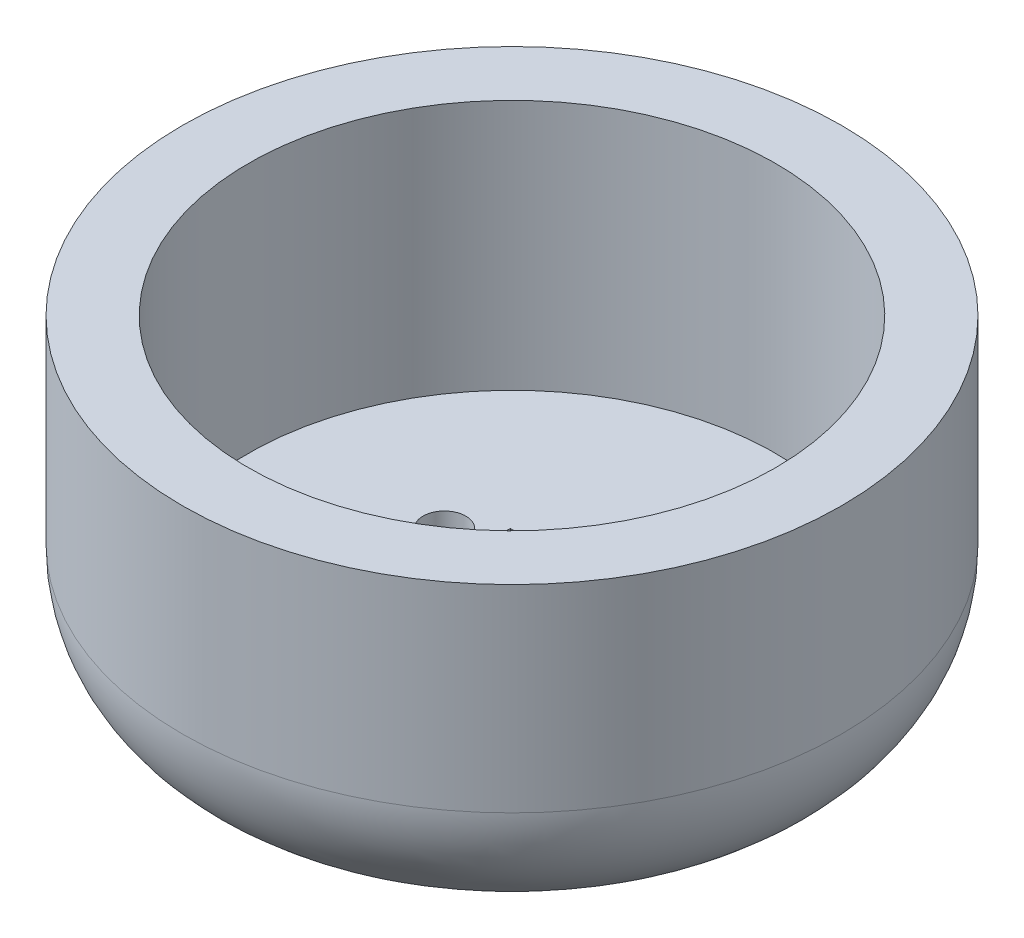
ISO-10303-21;
HEADER;
FILE_DESCRIPTION(('STEP AP214'),'2;1');
FILE_NAME('part.step','',(''),(''),'','','');
FILE_SCHEMA(('AUTOMOTIVE_DESIGN { 1 0 10303 214 1 1 1 1 }'));
ENDSEC;
DATA;
#1=APPLICATION_CONTEXT('core data for automotive mechanical design processes');
#2=APPLICATION_PROTOCOL_DEFINITION('international standard','automotive_design',2000,#1);
#3=PRODUCT_CONTEXT('',#1,'mechanical');
#4=PRODUCT('Part','Part','',(#3));
#5=PRODUCT_RELATED_PRODUCT_CATEGORY('part','',(#4));
#6=PRODUCT_DEFINITION_FORMATION('','',#4);
#7=PRODUCT_DEFINITION_CONTEXT('part definition',#1,'design');
#8=PRODUCT_DEFINITION('design','',#6,#7);
#9=PRODUCT_DEFINITION_SHAPE('','',#8);
#10=(LENGTH_UNIT() NAMED_UNIT(*) SI_UNIT(.MILLI.,.METRE.));
#11=(NAMED_UNIT(*) PLANE_ANGLE_UNIT() SI_UNIT($,.RADIAN.));
#12=(NAMED_UNIT(*) SI_UNIT($,.STERADIAN.) SOLID_ANGLE_UNIT());
#13=UNCERTAINTY_MEASURE_WITH_UNIT(LENGTH_MEASURE(1.E-05),#10,'distance_accuracy_value','');
#14=(GEOMETRIC_REPRESENTATION_CONTEXT(3) GLOBAL_UNCERTAINTY_ASSIGNED_CONTEXT((#13)) GLOBAL_UNIT_ASSIGNED_CONTEXT((#10,
#11,#12)) REPRESENTATION_CONTEXT('',''));
#15=CARTESIAN_POINT('',(0.,0.,0.));
#16=DIRECTION('',(0.,0.,1.));
#17=DIRECTION('',(1.,0.,0.));
#18=AXIS2_PLACEMENT_3D('',#15,#16,#17);
#19=CARTESIAN_POINT('',(-40.,11.9,0.));
#20=DIRECTION('',(0.,1.,0.));
#21=DIRECTION('',(-1.,0.,0.));
#22=AXIS2_PLACEMENT_3D('',#19,#20,#21);
#23=PLANE('',#22);
#24=CARTESIAN_POINT('',(-15.25,11.9,5.));
#25=DIRECTION('',(0.,1.,0.));
#26=DIRECTION('',(1.,0.,0.));
#27=AXIS2_PLACEMENT_3D('',#24,#25,#26);
#28=CIRCLE('',#27,3.25);
#29=CARTESIAN_POINT('',(-12.,11.9,5.));
#30=VERTEX_POINT('',#29);
#31=EDGE_CURVE('E240',#30,#30,#28,.T.);
#32=ORIENTED_EDGE('',*,*,#31,.F.);
#33=EDGE_LOOP('',(#32));
#34=FACE_BOUND('',#33,.T.);
#35=CARTESIAN_POINT('',(34.25,11.9,5.));
#36=DIRECTION('',(0.,1.,0.));
#37=DIRECTION('',(-1.,0.,0.));
#38=AXIS2_PLACEMENT_3D('',#35,#36,#37);
#39=CIRCLE('',#38,3.25000000000001);
#40=CARTESIAN_POINT('',(31.,11.9,5.));
#41=VERTEX_POINT('',#40);
#42=EDGE_CURVE('E244',#41,#41,#39,.T.);
#43=ORIENTED_EDGE('',*,*,#42,.F.);
#44=EDGE_LOOP('',(#43));
#45=FACE_BOUND('',#44,.T.);
#46=CARTESIAN_POINT('',(34.25,11.9,-5.));
#47=DIRECTION('',(0.,1.,0.));
#48=DIRECTION('',(1.,0.,0.));
#49=AXIS2_PLACEMENT_3D('',#46,#47,#48);
#50=CIRCLE('',#49,3.25000000000001);
#51=CARTESIAN_POINT('',(37.5,11.9,-5.));
#52=VERTEX_POINT('',#51);
#53=EDGE_CURVE('E248',#52,#52,#50,.T.);
#54=ORIENTED_EDGE('',*,*,#53,.F.);
#55=EDGE_LOOP('',(#54));
#56=FACE_BOUND('',#55,.T.);
#57=CARTESIAN_POINT('',(-15.25,11.9,-5.));
#58=DIRECTION('',(0.,1.,0.));
#59=DIRECTION('',(-1.,0.,0.));
#60=AXIS2_PLACEMENT_3D('',#57,#58,#59);
#61=CIRCLE('',#60,3.25);
#62=CARTESIAN_POINT('',(-18.5,11.9,-5.));
#63=VERTEX_POINT('',#62);
#64=EDGE_CURVE('E179',#63,#63,#61,.T.);
#65=ORIENTED_EDGE('',*,*,#64,.F.);
#66=EDGE_LOOP('',(#65));
#67=FACE_BOUND('',#66,.T.);
#68=CARTESIAN_POINT('',(0.,11.9,0.));
#69=DIRECTION('',(0.,-1.,0.));
#70=DIRECTION('',(1.,0.,0.));
#71=AXIS2_PLACEMENT_3D('',#68,#69,#70);
#72=CIRCLE('',#71,40.);
#73=CARTESIAN_POINT('',(40.,11.9,0.));
#74=VERTEX_POINT('',#73);
#75=EDGE_CURVE('E155',#74,#74,#72,.T.);
#76=ORIENTED_EDGE('',*,*,#75,.F.);
#77=EDGE_LOOP('',(#76));
#78=FACE_BOUND('',#77,.T.);
#79=DIRECTION('',(0.,0.,-1.));
#80=VECTOR('',#79,1.);
#81=CARTESIAN_POINT('',(-10.25,11.9,10.));
#82=LINE('',#81,#80);
#83=CARTESIAN_POINT('',(-10.25,11.9,10.));
#84=VERTEX_POINT('',#83);
#85=CARTESIAN_POINT('',(-10.25,11.9,-10.));
#86=VERTEX_POINT('',#85);
#87=EDGE_CURVE('E145',#84,#86,#82,.T.);
#88=ORIENTED_EDGE('',*,*,#87,.T.);
#89=DIRECTION('',(1.,0.,0.));
#90=VECTOR('',#89,1.);
#91=CARTESIAN_POINT('',(-10.25,11.9,-10.));
#92=LINE('',#91,#90);
#93=CARTESIAN_POINT('',(29.25,11.9,-10.));
#94=VERTEX_POINT('',#93);
#95=EDGE_CURVE('E79',#86,#94,#92,.T.);
#96=ORIENTED_EDGE('',*,*,#95,.T.);
#97=DIRECTION('',(0.,0.,-1.));
#98=VECTOR('',#97,1.);
#99=CARTESIAN_POINT('',(29.25,11.9,10.));
#100=LINE('',#99,#98);
#101=CARTESIAN_POINT('',(29.25,11.9,10.));
#102=VERTEX_POINT('',#101);
#103=EDGE_CURVE('E139',#102,#94,#100,.T.);
#104=ORIENTED_EDGE('',*,*,#103,.F.);
#105=DIRECTION('',(1.,0.,0.));
#106=VECTOR('',#105,1.);
#107=CARTESIAN_POINT('',(-10.25,11.9,10.));
#108=LINE('',#107,#106);
#109=EDGE_CURVE('E116',#84,#102,#108,.T.);
#110=ORIENTED_EDGE('',*,*,#109,.F.);
#111=EDGE_LOOP('',(#88,#96,#104,#110));
#112=FACE_BOUND('',#111,.T.);
#113=ADVANCED_FACE('F60',(#34,#45,#56,#67,#78,#112),#23,.T.);
#114=CARTESIAN_POINT('',(0.,0.,0.));
#115=DIRECTION('',(0.,-1.,0.));
#116=DIRECTION('',(1.,0.,0.));
#117=AXIS2_PLACEMENT_3D('',#114,#115,#116);
#118=PLANE('',#117);
#119=CARTESIAN_POINT('',(-15.25,0.,5.));
#120=DIRECTION('',(0.,-1.,0.));
#121=DIRECTION('',(1.,0.,0.));
#122=AXIS2_PLACEMENT_3D('',#119,#120,#121);
#123=CIRCLE('',#122,3.25);
#124=CARTESIAN_POINT('',(-12.,0.,5.));
#125=VERTEX_POINT('',#124);
#126=EDGE_CURVE('E65',#125,#125,#123,.T.);
#127=ORIENTED_EDGE('',*,*,#126,.F.);
#128=EDGE_LOOP('',(#127));
#129=FACE_BOUND('',#128,.T.);
#130=CARTESIAN_POINT('',(-15.25,0.,-5.));
#131=DIRECTION('',(0.,-1.,0.));
#132=DIRECTION('',(1.,0.,0.));
#133=AXIS2_PLACEMENT_3D('',#130,#131,#132);
#134=CIRCLE('',#133,3.25);
#135=CARTESIAN_POINT('',(-12.,0.,-5.));
#136=VERTEX_POINT('',#135);
#137=EDGE_CURVE('E274',#136,#136,#134,.T.);
#138=ORIENTED_EDGE('',*,*,#137,.F.);
#139=EDGE_LOOP('',(#138));
#140=FACE_BOUND('',#139,.T.);
#141=CARTESIAN_POINT('',(0.,0.,0.));
#142=DIRECTION('',(0.,-1.,0.));
#143=DIRECTION('',(1.,0.,0.));
#144=AXIS2_PLACEMENT_3D('',#141,#142,#143);
#145=CIRCLE('',#144,6.375);
#146=CARTESIAN_POINT('',(6.375,0.,0.));
#147=VERTEX_POINT('',#146);
#148=EDGE_CURVE('E140',#147,#147,#145,.T.);
#149=ORIENTED_EDGE('',*,*,#148,.F.);
#150=EDGE_LOOP('',(#149));
#151=FACE_BOUND('',#150,.T.);
#152=CARTESIAN_POINT('',(0.,0.,0.));
#153=DIRECTION('',(0.,-1.,0.));
#154=DIRECTION('',(1.,0.,0.));
#155=AXIS2_PLACEMENT_3D('',#152,#153,#154);
#156=CIRCLE('',#155,30.);
#157=CARTESIAN_POINT('',(30.,0.,0.));
#158=VERTEX_POINT('',#157);
#159=EDGE_CURVE('E71',#158,#158,#156,.T.);
#160=ORIENTED_EDGE('',*,*,#159,.T.);
#161=EDGE_LOOP('',(#160));
#162=FACE_BOUND('',#161,.T.);
#163=ADVANCED_FACE('F229',(#129,#140,#151,#162),#118,.T.);
#164=CARTESIAN_POINT('',(0.,0.,0.));
#165=DIRECTION('',(0.,-1.,0.));
#166=DIRECTION('',(1.,0.,0.));
#167=AXIS2_PLACEMENT_3D('',#164,#165,#166);
#168=CYLINDRICAL_SURFACE('',#167,50.);
#169=CARTESIAN_POINT('',(0.,20.,0.));
#170=DIRECTION('',(0.,-1.,0.));
#171=DIRECTION('',(1.,0.,0.));
#172=AXIS2_PLACEMENT_3D('',#169,#170,#171);
#173=CIRCLE('',#172,50.);
#174=CARTESIAN_POINT('',(50.,20.,0.));
#175=VERTEX_POINT('',#174);
#176=EDGE_CURVE('E12',#175,#175,#173,.F.);
#177=ORIENTED_EDGE('',*,*,#176,.T.);
#178=EDGE_LOOP('',(#177));
#179=FACE_BOUND('',#178,.T.);
#180=CARTESIAN_POINT('',(0.,50.,0.));
#181=DIRECTION('',(0.,-1.,0.));
#182=DIRECTION('',(1.,0.,0.));
#183=AXIS2_PLACEMENT_3D('',#180,#181,#182);
#184=CIRCLE('',#183,50.);
#185=CARTESIAN_POINT('',(50.,50.,0.));
#186=VERTEX_POINT('',#185);
#187=EDGE_CURVE('E163',#186,#186,#184,.T.);
#188=ORIENTED_EDGE('',*,*,#187,.T.);
#189=EDGE_LOOP('',(#188));
#190=FACE_BOUND('',#189,.T.);
#191=ADVANCED_FACE('F225',(#179,#190),#168,.T.);
#192=CARTESIAN_POINT('',(-50.,50.,0.));
#193=DIRECTION('',(0.,1.,0.));
#194=DIRECTION('',(-1.,0.,0.));
#195=AXIS2_PLACEMENT_3D('',#192,#193,#194);
#196=PLANE('',#195);
#197=CARTESIAN_POINT('',(0.,50.,0.));
#198=DIRECTION('',(0.,-1.,0.));
#199=DIRECTION('',(1.,0.,0.));
#200=AXIS2_PLACEMENT_3D('',#197,#198,#199);
#201=CIRCLE('',#200,40.);
#202=CARTESIAN_POINT('',(40.,50.,0.));
#203=VERTEX_POINT('',#202);
#204=EDGE_CURVE('E159',#203,#203,#201,.T.);
#205=ORIENTED_EDGE('',*,*,#204,.T.);
#206=EDGE_LOOP('',(#205));
#207=FACE_BOUND('',#206,.T.);
#208=ORIENTED_EDGE('',*,*,#187,.F.);
#209=EDGE_LOOP('',(#208));
#210=FACE_BOUND('',#209,.T.);
#211=ADVANCED_FACE('F221',(#207,#210),#196,.T.);
#212=CARTESIAN_POINT('',(0.,0.,0.));
#213=DIRECTION('',(0.,-1.,0.));
#214=DIRECTION('',(1.,0.,0.));
#215=AXIS2_PLACEMENT_3D('',#212,#213,#214);
#216=CYLINDRICAL_SURFACE('',#215,40.);
#217=ORIENTED_EDGE('',*,*,#75,.T.);
#218=EDGE_LOOP('',(#217));
#219=FACE_BOUND('',#218,.T.);
#220=ORIENTED_EDGE('',*,*,#204,.F.);
#221=EDGE_LOOP('',(#220));
#222=FACE_BOUND('',#221,.T.);
#223=ADVANCED_FACE('F218',(#219,#222),#216,.F.);
#224=CARTESIAN_POINT('',(0.,20.,0.));
#225=DIRECTION('',(0.,-1.,0.));
#226=DIRECTION('',(1.,0.,0.));
#227=AXIS2_PLACEMENT_3D('',#224,#225,#226);
#228=TOROIDAL_SURFACE('',#227,30.,20.);
#229=CARTESIAN_POINT('',(32.0479077914188,0.116330353556517,2.60975106765627));
#230=CARTESIAN_POINT('',(32.1814970760668,0.129673743611048,2.48668883655828));
#231=CARTESIAN_POINT('',(32.3253794523304,0.145478724602227,2.37489926201599));
#232=CARTESIAN_POINT('',(32.629345420667,0.182784337638467,2.17707133558024));
#233=CARTESIAN_POINT('',(32.7894448205612,0.204290560729942,2.09105843951675));
#234=CARTESIAN_POINT('',(33.1207777934012,0.253414408836487,1.94714207260018));
#235=CARTESIAN_POINT('',(33.2920017275323,0.281026791771027,1.8892146260164));
#236=CARTESIAN_POINT('',(33.6405825894698,0.342351806506335,1.8025995750051));
#237=CARTESIAN_POINT('',(33.8179385276172,0.376063457614575,1.77390727481194));
#238=CARTESIAN_POINT('',(34.1756838143113,0.449477691833684,1.74584695082722));
#239=CARTESIAN_POINT('',(34.3560853700151,0.489240130078387,1.74679377748627));
#240=CARTESIAN_POINT('',(34.713174052161,0.573503050009819,1.77818161118171));
#241=CARTESIAN_POINT('',(34.8898604635039,0.618004434041157,1.80862824425851));
#242=CARTESIAN_POINT('',(35.2405873054847,0.711852594448193,1.89918034495455));
#243=CARTESIAN_POINT('',(35.4143604254905,0.761309098014474,1.96020711268544));
#244=CARTESIAN_POINT('',(35.7487650025296,0.861953524685926,2.11039469171589));
#245=CARTESIAN_POINT('',(35.9093936278131,0.913141817534967,2.19956154531246));
#246=CARTESIAN_POINT('',(36.2181102742792,1.01668591238047,2.40680831482489));
#247=CARTESIAN_POINT('',(36.36566848397,1.06902988909717,2.52568492089967));
#248=CARTESIAN_POINT('',(36.6384634527318,1.17077088765563,2.78786701080655));
#249=CARTESIAN_POINT('',(36.7636985077735,1.22016768433426,2.93117435791748));
#250=CARTESIAN_POINT('',(36.9875026869546,1.313124516878,3.2380441710002));
#251=CARTESIAN_POINT('',(37.0861792144011,1.35670769085167,3.40152103303562));
#252=CARTESIAN_POINT('',(37.2539333412282,1.43556637824925,3.74486978545188));
#253=CARTESIAN_POINT('',(37.3230209842605,1.47084470883535,3.92473608741905));
#254=CARTESIAN_POINT('',(37.4259180743589,1.5291024026808,4.28617068065483));
#255=CARTESIAN_POINT('',(37.4613305141542,1.55261216496793,4.46719597648451));
#256=CARTESIAN_POINT('',(37.5009660463911,1.58821467432393,4.83371661902443));
#257=CARTESIAN_POINT('',(37.5052033644566,1.60031262655664,5.01920988816613));
#258=CARTESIAN_POINT('',(37.4826978332986,1.61181652060845,5.37735225979627));
#259=CARTESIAN_POINT('',(37.4578197531758,1.61194825042189,5.55009759152612));
#260=CARTESIAN_POINT('',(37.3808594405726,1.6013322388613,5.88905010114238));
#261=CARTESIAN_POINT('',(37.3287806052009,1.59058585590013,6.05525809269205));
#262=CARTESIAN_POINT('',(37.2004143783625,1.55923638089429,6.37348994447202));
#263=CARTESIAN_POINT('',(37.1245803726077,1.53881448918054,6.52571550588862));
#264=CARTESIAN_POINT('',(36.9509200907217,1.48945012825454,6.81551100354553));
#265=CARTESIAN_POINT('',(36.8530905723119,1.46050640267482,6.95307877472336));
#266=CARTESIAN_POINT('',(36.6342830686582,1.39448312308916,7.21539150199092));
#267=CARTESIAN_POINT('',(36.5125695611235,1.35713728010093,7.3394547613273));
#268=CARTESIAN_POINT('',(36.252036701132,1.27699236377604,7.56596402209486));
#269=CARTESIAN_POINT('',(36.1132123909308,1.23419170982047,7.66840373481175));
#270=CARTESIAN_POINT('',(35.8129414309461,1.1424024740187,7.85532518074856));
#271=CARTESIAN_POINT('',(35.6506271308573,1.0931949782278,7.93830702736586));
#272=CARTESIAN_POINT('',(35.3148390358828,0.993233129013502,8.07596571250446));
#273=CARTESIAN_POINT('',(35.1413623805881,0.942478380866521,8.13063526312273));
#274=CARTESIAN_POINT('',(34.7802984473277,0.839523680234328,8.21199306989151));
#275=CARTESIAN_POINT('',(34.5924242335287,0.78734932704635,8.23744777914362));
#276=CARTESIAN_POINT('',(34.2143247095027,0.685863966434733,8.25531011612679));
#277=CARTESIAN_POINT('',(34.0240993769862,0.636552986182205,8.24771743031652));
#278=CARTESIAN_POINT('',(33.6475169581082,0.542837843527736,8.19928041408786));
#279=CARTESIAN_POINT('',(33.4611470546484,0.498414088345899,8.15857479215674));
#280=CARTESIAN_POINT('',(33.0971992147788,0.415632064776228,8.04464862804083));
#281=CARTESIAN_POINT('',(32.9196194202861,0.377272510723839,7.97143499041429));
#282=CARTESIAN_POINT('',(32.5848303090509,0.308614831579545,7.79716275817839));
#283=CARTESIAN_POINT('',(32.4271363899979,0.278088735890836,7.69712487869992));
#284=CARTESIAN_POINT('',(32.1305238363237,0.223643148073061,7.47084930031479));
#285=CARTESIAN_POINT('',(31.9916020846616,0.199722558436959,7.34461595990462));
#286=CARTESIAN_POINT('',(31.7408162047274,0.158725844885709,7.07355030176566));
#287=CARTESIAN_POINT('',(31.6282879181635,0.141472404905726,6.92935850863098));
#288=CARTESIAN_POINT('',(31.4288095583625,0.112138509797297,6.62378265384963));
#289=CARTESIAN_POINT('',(31.341858271173,0.100057809144485,6.46239940865038));
#290=CARTESIAN_POINT('',(31.1968526994459,0.0802403439959859,6.12855320969464));
#291=CARTESIAN_POINT('',(31.1385565344681,0.0724671457597387,5.9561973747691));
#292=CARTESIAN_POINT('',(31.0514873782579,0.0602206315630116,5.60407637580216));
#293=CARTESIAN_POINT('',(31.0227136867148,0.0557472373276962,5.42431138762051));
#294=CARTESIAN_POINT('',(30.9955103401975,0.0494091608920858,5.06208390802416));
#295=CARTESIAN_POINT('',(30.9971432429549,0.0475498653186785,4.8796166272996));
#296=CARTESIAN_POINT('',(31.0308791727812,0.0461174200176847,4.51746866186668));
#297=CARTESIAN_POINT('',(31.062988901566,0.0465447732096546,4.33778859888728));
#298=CARTESIAN_POINT('',(31.1568721325575,0.0497710395824331,3.98594925085521));
#299=CARTESIAN_POINT('',(31.2187130322666,0.0525753521607181,3.81380802773531));
#300=CARTESIAN_POINT('',(31.3702784408663,0.0610510253430144,3.48249481877038));
#301=CARTESIAN_POINT('',(31.459974240481,0.0667194377530957,3.3233096916653));
#302=CARTESIAN_POINT('',(31.6321247901168,0.0793306125277555,3.0700454359743));
#303=CARTESIAN_POINT('',(31.7078929450235,0.0853028776106721,2.97130141120129));
#304=CARTESIAN_POINT('',(31.870141220241,0.0992437349678313,2.78320070024684));
#305=CARTESIAN_POINT('',(31.9566213312151,0.107212325502055,2.6938440058834));
#306=CARTESIAN_POINT('',(32.0479077914188,0.116330353556517,2.60975106765627));
#307=B_SPLINE_CURVE_WITH_KNOTS('',3,(#229,#230,#231,#232,#233,#234,#235,#236,#237,#238,#239,
#240,#241,#242,#243,#244,#245,#246,#247,#248,#249,#250,#251,#252,#253,#254,#255,#256,#257,#258,
#259,#260,#261,#262,#263,#264,#265,#266,#267,#268,#269,#270,#271,#272,#273,#274,#275,#276,#277,
#278,#279,#280,#281,#282,#283,#284,#285,#286,#287,#288,#289,#290,#291,#292,#293,#294,#295,#296,
#297,#298,#299,#300,#301,#302,#303,#304,#305,#306),.UNSPECIFIED.,.T.,.F.,(4,2,2,2,2,2,2,2,2,2,2,
2,2,2,2,2,2,2,2,2,2,2,2,2,2,2,2,2,2,2,2,2,2,2,2,2,2,2,4),(0.,0.545910494996206,1.09235834219054,
1.63833887779265,2.18423170386363,2.73592538748955,3.28772430780722,3.85724840308156,
4.42689487103793,5.0138619259999,5.60087376769051,6.18547478094819,6.76987719964703,
7.32481613188973,7.87950182237831,8.40052017973622,8.92147348254329,9.4330344843596,
9.94467094302096,10.4756567765794,11.0067968231143,11.5707412282258,12.134830726898,
12.7219508113851,13.3090764662604,13.893755268128,14.4783099461722,15.0431795398399,
15.6079552236888,16.1564616333845,16.7049420053055,17.2487095065879,17.7924641087161,
18.3373375407102,18.8823308156687,19.4285654016538,19.9742388568252,20.3472798551621,
20.7203205283538),.UNSPECIFIED.);
#308=CARTESIAN_POINT('',(32.0479077914188,0.116330353556517,2.60975106765627));
#309=VERTEX_POINT('',#308);
#310=EDGE_CURVE('E178',#309,#309,#307,.T.);
#311=ORIENTED_EDGE('',*,*,#310,.F.);
#312=EDGE_LOOP('',(#311));
#313=FACE_BOUND('',#312,.T.);
#314=CARTESIAN_POINT('',(32.0907875095826,0.217193196293646,-7.42905360608313));
#315=CARTESIAN_POINT('',(32.2281141674023,0.241166161432333,-7.55111275525881));
#316=CARTESIAN_POINT('',(32.3756065575701,0.268297080090553,-7.6613066732427));
#317=CARTESIAN_POINT('',(32.6861880820453,0.328942756622416,-7.85491885234064));
#318=CARTESIAN_POINT('',(32.8492952799999,0.362464953642105,-7.93830560432249));
#319=CARTESIAN_POINT('',(33.185741107598,0.435357641911429,-8.07617313502473));
#320=CARTESIAN_POINT('',(33.3590626698699,0.474718535301073,-8.13070069393697));
#321=CARTESIAN_POINT('',(33.7111569144456,0.558366193226857,-8.21009799076797));
#322=CARTESIAN_POINT('',(33.8899289224587,0.602652350224487,-8.23497138214561));
#323=CARTESIAN_POINT('',(34.2524677423729,0.695895154613315,-8.25518563005708));
#324=CARTESIAN_POINT('',(34.4362521735756,0.744937869423469,-8.24980958053348));
#325=CARTESIAN_POINT('',(34.7998082831178,0.844966787792217,-8.20838018226056));
#326=CARTESIAN_POINT('',(34.9795789977648,0.895953450302214,-8.17231954573317));
#327=CARTESIAN_POINT('',(35.3361130036835,0.99939732386276,-8.06893796534634));
#328=CARTESIAN_POINT('',(35.5126033440065,1.05185028516061,-8.00066842739001));
#329=CARTESIAN_POINT('',(35.8517330398007,1.1541055525158,-7.83419036102324));
#330=CARTESIAN_POINT('',(36.0143710518949,1.20390760131654,-7.73597893311496));
#331=CARTESIAN_POINT('',(36.3208436409563,1.29811238081241,-7.51198527813475));
#332=CARTESIAN_POINT('',(36.4647061817811,1.34252313415653,-7.38624481788253));
#333=CARTESIAN_POINT('',(36.7291941136153,1.42330604905619,-7.11012038500563));
#334=CARTESIAN_POINT('',(36.8498269376074,1.45968078250636,-6.95974432381391));
#335=CARTESIAN_POINT('',(37.0582084853683,1.52035378495387,-6.64625616103905));
#336=CARTESIAN_POINT('',(37.14726533321,1.54515099115254,-6.48411162093351));
#337=CARTESIAN_POINT('',(37.2968767327944,1.58339801547148,-6.14594068583619));
#338=CARTESIAN_POINT('',(37.3574445231775,1.59685310649046,-5.96992078310423));
#339=CARTESIAN_POINT('',(37.4449178732002,1.61094691351368,-5.62078869559845));
#340=CARTESIAN_POINT('',(37.4736686230197,1.61232466896239,-5.44816633535232));
#341=CARTESIAN_POINT('',(37.5031060945696,1.60410347864189,-5.10082297328671));
#342=CARTESIAN_POINT('',(37.5037968765728,1.59450612117633,-4.9261022787558));
#343=CARTESIAN_POINT('',(37.4776701571645,1.56531496100681,-4.58338980140761));
#344=CARTESIAN_POINT('',(37.4514369900137,1.54593795260498,-4.41533392894513));
#345=CARTESIAN_POINT('',(37.3735564965544,1.49851232061283,-4.08651474416057));
#346=CARTESIAN_POINT('',(37.3219057127995,1.47046251749345,-3.9257524271989));
#347=CARTESIAN_POINT('',(37.1928086201081,1.40615456438623,-3.60985178423043));
#348=CARTESIAN_POINT('',(37.1145167924106,1.36964180967127,-3.45511177183457));
#349=CARTESIAN_POINT('',(36.9352019791859,1.29097315752675,-3.16101152108349));
#350=CARTESIAN_POINT('',(36.8341724936166,1.24881564782285,-3.02165569763824));
#351=CARTESIAN_POINT('',(36.6052727991736,1.15814567273528,-2.75318271594271));
#352=CARTESIAN_POINT('',(36.4761318904168,1.10940165700333,-2.62522633715401));
#353=CARTESIAN_POINT('',(36.1987875882537,1.01012769495489,-2.39280142726096));
#354=CARTESIAN_POINT('',(36.0505791469005,0.959597278284127,-2.28833913619005));
#355=CARTESIAN_POINT('',(35.7320599399872,0.856749968975682,-2.10146125020866));
#356=CARTESIAN_POINT('',(35.5610732818069,0.804449560311766,-2.02018525704657));
#357=CARTESIAN_POINT('',(35.2068948567371,0.702478843209816,-1.8883189887806));
#358=CARTESIAN_POINT('',(35.023702774799,0.652808602721578,-1.83772950610306));
#359=CARTESIAN_POINT('',(34.6504735074743,0.558064063679244,-1.76920313947081));
#360=CARTESIAN_POINT('',(34.4604486836879,0.512981979785767,-1.75121004259196));
#361=CARTESIAN_POINT('',(34.0788747168842,0.428771258582961,-1.74890890618485));
#362=CARTESIAN_POINT('',(33.88732589542,0.389641398704806,-1.76459393923919));
#363=CARTESIAN_POINT('',(33.5150097083414,0.319402185323724,-1.82875540541431));
#364=CARTESIAN_POINT('',(33.3340950680993,0.288071012032599,-1.87613416174744));
#365=CARTESIAN_POINT('',(32.982185954108,0.23205109184794,-2.00166268638544));
#366=CARTESIAN_POINT('',(32.8111897398797,0.207361176767825,-2.07980703710653));
#367=CARTESIAN_POINT('',(32.4895119979309,0.164956454689553,-2.26205535746692));
#368=CARTESIAN_POINT('',(32.338377295459,0.147055906076406,-2.36531739729964));
#369=CARTESIAN_POINT('',(32.0552676198031,0.116532195314063,-2.59604708118244));
#370=CARTESIAN_POINT('',(31.9232916601313,0.103908761382142,-2.72351347816439));
#371=CARTESIAN_POINT('',(31.6836658564979,0.083134541568755,-2.99768549447707));
#372=CARTESIAN_POINT('',(31.5757942210522,0.0749418993928478,-3.14419424824774));
#373=CARTESIAN_POINT('',(31.3859208024093,0.0619481472180428,-3.4532479611113));
#374=CARTESIAN_POINT('',(31.3039191833428,0.0571470587364275,-3.61579302193707));
#375=CARTESIAN_POINT('',(31.1680175348398,0.0502147978457502,-3.95265331874195));
#376=CARTESIAN_POINT('',(31.1141722362323,0.0480888141677955,-4.12699073991608));
#377=CARTESIAN_POINT('',(31.0363629757975,0.0461402738356163,-4.48221923051938));
#378=CARTESIAN_POINT('',(31.0123984975902,0.0463176773752063,-4.6631101866392));
#379=CARTESIAN_POINT('',(30.9950078080228,0.0490120504473559,-5.02668465018218));
#380=CARTESIAN_POINT('',(31.0016400412348,0.051533490122616,-5.20937092251489));
#381=CARTESIAN_POINT('',(31.0453795711585,0.0593707987855487,-5.57104186324875));
#382=CARTESIAN_POINT('',(31.0824932893248,0.0646872565074174,-5.75002574353068));
#383=CARTESIAN_POINT('',(31.1860685186021,0.0788761539007231,-6.0990762152686));
#384=CARTESIAN_POINT('',(31.2525221520333,0.0877476389988868,-6.269145186648));
#385=CARTESIAN_POINT('',(31.4127315089409,0.109961852412586,-6.59542027407783));
#386=CARTESIAN_POINT('',(31.5064569640309,0.123299626155902,-6.75164150998303));
#387=CARTESIAN_POINT('',(31.6821570357769,0.149839701674062,-6.9957494350651));
#388=CARTESIAN_POINT('',(31.7572890163734,0.161545657243549,-7.08880831941134));
#389=CARTESIAN_POINT('',(31.9171210057152,0.187457015045001,-7.26592259823494));
#390=CARTESIAN_POINT('',(32.0018209547653,0.201662401683159,-7.34997804887893));
#391=CARTESIAN_POINT('',(32.0907875095826,0.217193196293646,-7.42905360608313));
#392=B_SPLINE_CURVE_WITH_KNOTS('',3,(#314,#315,#316,#317,#318,#319,#320,#321,#322,#323,#324,
#325,#326,#327,#328,#329,#330,#331,#332,#333,#334,#335,#336,#337,#338,#339,#340,#341,#342,#343,
#344,#345,#346,#347,#348,#349,#350,#351,#352,#353,#354,#355,#356,#357,#358,#359,#360,#361,#362,
#363,#364,#365,#366,#367,#368,#369,#370,#371,#372,#373,#374,#375,#376,#377,#378,#379,#380,#381,
#382,#383,#384,#385,#386,#387,#388,#389,#390,#391),.UNSPECIFIED.,.T.,.F.,(4,2,2,2,2,2,2,2,2,2,2,
2,2,2,2,2,2,2,2,2,2,2,2,2,2,2,2,2,2,2,2,2,2,2,2,2,2,2,4),(0.,0.555415814766225,1.11148209820021,
1.66664422672102,2.22173795097167,2.79004186573998,3.35848079386838,3.94481918677777,
4.53121437727736,5.11672598422591,5.70204992828298,6.2590683866766,6.8158277466366,
7.33826044731119,7.86061755179163,8.37187275869047,8.88319752861374,9.41255586365388,
9.94206571966018,10.5042181770892,11.0665197664381,11.6529721057036,12.2394395884472,
12.8248947335385,13.4102294650668,13.9762744602299,14.5422198237874,15.0913196506686,
15.640391194246,16.1841809748485,16.7279742054254,17.2728205794566,17.8176575376906,
18.3635356513868,18.909528793303,19.455375426755,20.0006185330741,20.3604448085683,
20.7202688392065),.UNSPECIFIED.);
#393=CARTESIAN_POINT('',(32.0907875095826,0.217193196293646,-7.42905360608313));
#394=VERTEX_POINT('',#393);
#395=EDGE_CURVE('E170',#394,#394,#392,.T.);
#396=ORIENTED_EDGE('',*,*,#395,.F.);
#397=EDGE_LOOP('',(#396));
#398=FACE_BOUND('',#397,.T.);
#399=ORIENTED_EDGE('',*,*,#176,.F.);
#400=EDGE_LOOP('',(#399));
#401=FACE_BOUND('',#400,.T.);
#402=ORIENTED_EDGE('',*,*,#159,.F.);
#403=EDGE_LOOP('',(#402));
#404=FACE_BOUND('',#403,.T.);
#405=ADVANCED_FACE('F62',(#313,#398,#401,#404),#228,.T.);
#406=CARTESIAN_POINT('',(-10.25,2.,-10.));
#407=DIRECTION('',(0.,0.,1.));
#408=DIRECTION('',(1.,0.,0.));
#409=AXIS2_PLACEMENT_3D('',#406,#407,#408);
#410=PLANE('',#409);
#411=ORIENTED_EDGE('',*,*,#95,.F.);
#412=DIRECTION('',(0.,1.,0.));
#413=VECTOR('',#412,1.);
#414=CARTESIAN_POINT('',(-10.25,2.,-10.));
#415=LINE('',#414,#413);
#416=CARTESIAN_POINT('',(-10.25,2.,-10.));
#417=VERTEX_POINT('',#416);
#418=EDGE_CURVE('E133',#417,#86,#415,.T.);
#419=ORIENTED_EDGE('',*,*,#418,.F.);
#420=DIRECTION('',(1.,0.,0.));
#421=VECTOR('',#420,1.);
#422=CARTESIAN_POINT('',(-10.25,2.,-10.));
#423=LINE('',#422,#421);
#424=CARTESIAN_POINT('',(29.25,2.,-10.));
#425=VERTEX_POINT('',#424);
#426=EDGE_CURVE('E107',#417,#425,#423,.T.);
#427=ORIENTED_EDGE('',*,*,#426,.T.);
#428=DIRECTION('',(0.,1.,0.));
#429=VECTOR('',#428,1.);
#430=CARTESIAN_POINT('',(29.25,2.,-10.));
#431=LINE('',#430,#429);
#432=EDGE_CURVE('E121',#425,#94,#431,.T.);
#433=ORIENTED_EDGE('',*,*,#432,.T.);
#434=EDGE_LOOP('',(#411,#419,#427,#433));
#435=FACE_BOUND('',#434,.T.);
#436=ADVANCED_FACE('F215',(#435),#410,.T.);
#437=CARTESIAN_POINT('',(29.25,2.,10.));
#438=DIRECTION('',(1.,0.,0.));
#439=DIRECTION('',(0.,1.,0.));
#440=AXIS2_PLACEMENT_3D('',#437,#438,#439);
#441=PLANE('',#440);
#442=ORIENTED_EDGE('',*,*,#103,.T.);
#443=ORIENTED_EDGE('',*,*,#432,.F.);
#444=DIRECTION('',(0.,0.,-1.));
#445=VECTOR('',#444,1.);
#446=CARTESIAN_POINT('',(29.25,2.,10.));
#447=LINE('',#446,#445);
#448=CARTESIAN_POINT('',(29.25,2.,10.));
#449=VERTEX_POINT('',#448);
#450=EDGE_CURVE('E124',#449,#425,#447,.T.);
#451=ORIENTED_EDGE('',*,*,#450,.F.);
#452=DIRECTION('',(0.,1.,0.));
#453=VECTOR('',#452,1.);
#454=CARTESIAN_POINT('',(29.25,2.,10.));
#455=LINE('',#454,#453);
#456=EDGE_CURVE('E110',#449,#102,#455,.T.);
#457=ORIENTED_EDGE('',*,*,#456,.T.);
#458=EDGE_LOOP('',(#442,#443,#451,#457));
#459=FACE_BOUND('',#458,.T.);
#460=ADVANCED_FACE('F125',(#459),#441,.F.);
#461=CARTESIAN_POINT('',(-10.25,2.,10.));
#462=DIRECTION('',(0.,0.,1.));
#463=DIRECTION('',(1.,0.,0.));
#464=AXIS2_PLACEMENT_3D('',#461,#462,#463);
#465=PLANE('',#464);
#466=ORIENTED_EDGE('',*,*,#109,.T.);
#467=ORIENTED_EDGE('',*,*,#456,.F.);
#468=DIRECTION('',(1.,0.,0.));
#469=VECTOR('',#468,1.);
#470=CARTESIAN_POINT('',(-10.25,2.,10.));
#471=LINE('',#470,#469);
#472=CARTESIAN_POINT('',(-10.25,2.,10.));
#473=VERTEX_POINT('',#472);
#474=EDGE_CURVE('E114',#473,#449,#471,.T.);
#475=ORIENTED_EDGE('',*,*,#474,.F.);
#476=DIRECTION('',(0.,1.,0.));
#477=VECTOR('',#476,1.);
#478=CARTESIAN_POINT('',(-10.25,2.,10.));
#479=LINE('',#478,#477);
#480=EDGE_CURVE('E102',#473,#84,#479,.T.);
#481=ORIENTED_EDGE('',*,*,#480,.T.);
#482=EDGE_LOOP('',(#466,#467,#475,#481));
#483=FACE_BOUND('',#482,.T.);
#484=ADVANCED_FACE('F112',(#483),#465,.F.);
#485=CARTESIAN_POINT('',(-10.25,2.,10.));
#486=DIRECTION('',(1.,0.,0.));
#487=DIRECTION('',(0.,1.,0.));
#488=AXIS2_PLACEMENT_3D('',#485,#486,#487);
#489=PLANE('',#488);
#490=ORIENTED_EDGE('',*,*,#87,.F.);
#491=ORIENTED_EDGE('',*,*,#480,.F.);
#492=DIRECTION('',(0.,0.,-1.));
#493=VECTOR('',#492,1.);
#494=CARTESIAN_POINT('',(-10.25,2.,10.));
#495=LINE('',#494,#493);
#496=EDGE_CURVE('E87',#473,#417,#495,.T.);
#497=ORIENTED_EDGE('',*,*,#496,.T.);
#498=ORIENTED_EDGE('',*,*,#418,.T.);
#499=EDGE_LOOP('',(#490,#491,#497,#498));
#500=FACE_BOUND('',#499,.T.);
#501=ADVANCED_FACE('F207',(#500),#489,.T.);
#502=CARTESIAN_POINT('',(0.,2.,0.));
#503=DIRECTION('',(0.,1.,0.));
#504=DIRECTION('',(0.,0.,1.));
#505=AXIS2_PLACEMENT_3D('',#502,#503,#504);
#506=PLANE('',#505);
#507=CARTESIAN_POINT('',(0.,2.,0.));
#508=DIRECTION('',(0.,1.,0.));
#509=DIRECTION('',(0.,0.,1.));
#510=AXIS2_PLACEMENT_3D('',#507,#508,#509);
#511=CIRCLE('',#510,6.375);
#512=CARTESIAN_POINT('',(0.,2.,6.375));
#513=VERTEX_POINT('',#512);
#514=EDGE_CURVE('E259',#513,#513,#511,.T.);
#515=ORIENTED_EDGE('',*,*,#514,.F.);
#516=EDGE_LOOP('',(#515));
#517=FACE_BOUND('',#516,.T.);
#518=ORIENTED_EDGE('',*,*,#426,.F.);
#519=ORIENTED_EDGE('',*,*,#496,.F.);
#520=ORIENTED_EDGE('',*,*,#474,.T.);
#521=ORIENTED_EDGE('',*,*,#450,.T.);
#522=EDGE_LOOP('',(#518,#519,#520,#521));
#523=FACE_BOUND('',#522,.T.);
#524=ADVANCED_FACE('F129',(#517,#523),#506,.T.);
#525=CARTESIAN_POINT('',(0.,-26.,0.));
#526=DIRECTION('',(0.,1.,0.));
#527=DIRECTION('',(-1.,0.,0.));
#528=AXIS2_PLACEMENT_3D('',#525,#526,#527);
#529=CYLINDRICAL_SURFACE('',#528,6.375);
#530=ORIENTED_EDGE('',*,*,#148,.T.);
#531=EDGE_LOOP('',(#530));
#532=FACE_BOUND('',#531,.T.);
#533=ORIENTED_EDGE('',*,*,#514,.T.);
#534=EDGE_LOOP('',(#533));
#535=FACE_BOUND('',#534,.T.);
#536=ADVANCED_FACE('F188',(#532,#535),#529,.F.);
#537=CARTESIAN_POINT('',(34.25,-26.,-5.));
#538=DIRECTION('',(0.,1.,0.));
#539=DIRECTION('',(-1.,0.,0.));
#540=AXIS2_PLACEMENT_3D('',#537,#538,#539);
#541=CYLINDRICAL_SURFACE('',#540,3.25000000000001);
#542=ORIENTED_EDGE('',*,*,#395,.T.);
#543=EDGE_LOOP('',(#542));
#544=FACE_BOUND('',#543,.T.);
#545=ORIENTED_EDGE('',*,*,#53,.T.);
#546=EDGE_LOOP('',(#545));
#547=FACE_BOUND('',#546,.T.);
#548=ADVANCED_FACE('F184',(#544,#547),#541,.F.);
#549=CARTESIAN_POINT('',(34.25,-26.,5.));
#550=DIRECTION('',(0.,1.,0.));
#551=DIRECTION('',(-1.,0.,0.));
#552=AXIS2_PLACEMENT_3D('',#549,#550,#551);
#553=CYLINDRICAL_SURFACE('',#552,3.25000000000001);
#554=ORIENTED_EDGE('',*,*,#310,.T.);
#555=EDGE_LOOP('',(#554));
#556=FACE_BOUND('',#555,.T.);
#557=ORIENTED_EDGE('',*,*,#42,.T.);
#558=EDGE_LOOP('',(#557));
#559=FACE_BOUND('',#558,.T.);
#560=ADVANCED_FACE('F187',(#556,#559),#553,.F.);
#561=CARTESIAN_POINT('',(-15.25,-26.,-5.));
#562=DIRECTION('',(0.,1.,0.));
#563=DIRECTION('',(-1.,0.,0.));
#564=AXIS2_PLACEMENT_3D('',#561,#562,#563);
#565=CYLINDRICAL_SURFACE('',#564,3.25);
#566=ORIENTED_EDGE('',*,*,#137,.T.);
#567=EDGE_LOOP('',(#566));
#568=FACE_BOUND('',#567,.T.);
#569=ORIENTED_EDGE('',*,*,#64,.T.);
#570=EDGE_LOOP('',(#569));
#571=FACE_BOUND('',#570,.T.);
#572=ADVANCED_FACE('F193',(#568,#571),#565,.F.);
#573=CARTESIAN_POINT('',(-15.25,-26.,5.));
#574=DIRECTION('',(0.,1.,0.));
#575=DIRECTION('',(-1.,0.,0.));
#576=AXIS2_PLACEMENT_3D('',#573,#574,#575);
#577=CYLINDRICAL_SURFACE('',#576,3.25);
#578=ORIENTED_EDGE('',*,*,#126,.T.);
#579=EDGE_LOOP('',(#578));
#580=FACE_BOUND('',#579,.T.);
#581=ORIENTED_EDGE('',*,*,#31,.T.);
#582=EDGE_LOOP('',(#581));
#583=FACE_BOUND('',#582,.T.);
#584=ADVANCED_FACE('F195',(#580,#583),#577,.F.);
#585=CLOSED_SHELL('',(#113,#163,#191,#211,#223,#405,#436,#460,#484,#501,#524,#536,#548,#560,
#572,#584));
#586=MANIFOLD_SOLID_BREP('B2',#585);
#587=ADVANCED_BREP_SHAPE_REPRESENTATION('',(#18,#586),#14);
#588=SHAPE_DEFINITION_REPRESENTATION(#9,#587);
ENDSEC;
END-ISO-10303-21;
